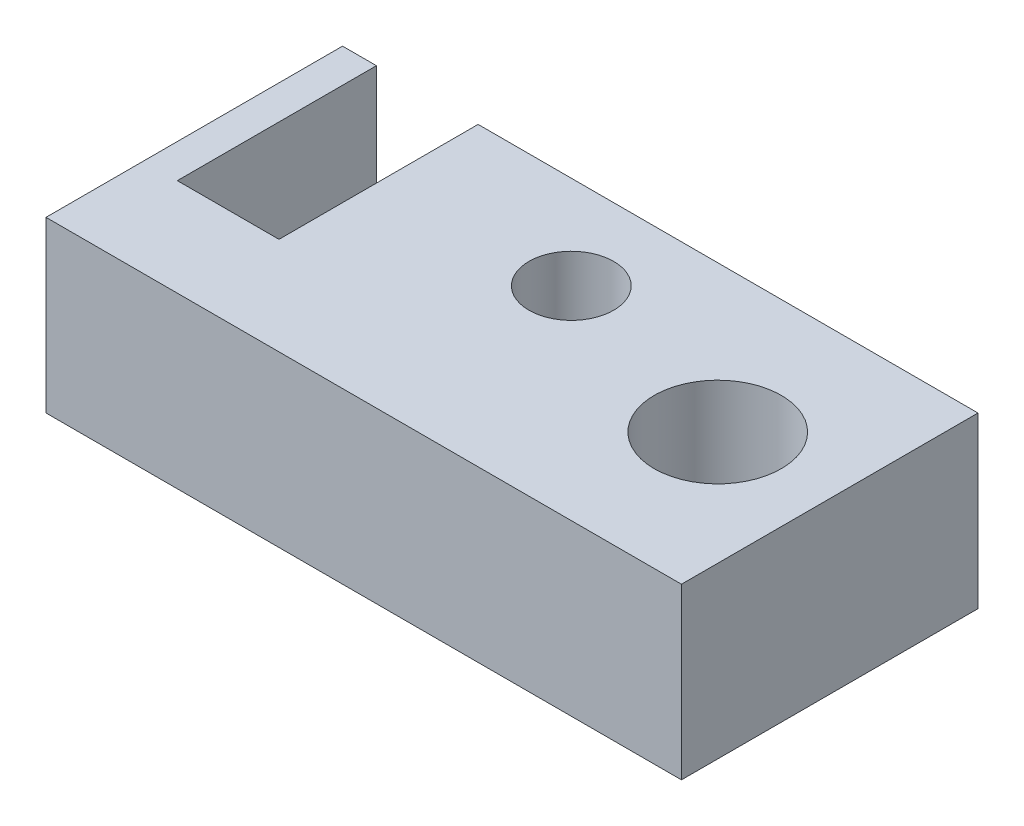
ISO-10303-21;
HEADER;
FILE_DESCRIPTION(('STEP AP214'),'2;1');
FILE_NAME('part.step','',(''),(''),'','','');
FILE_SCHEMA(('AUTOMOTIVE_DESIGN { 1 0 10303 214 1 1 1 1 }'));
ENDSEC;
DATA;
#1=APPLICATION_CONTEXT('core data for automotive mechanical design processes');
#2=APPLICATION_PROTOCOL_DEFINITION('international standard','automotive_design',2000,#1);
#3=PRODUCT_CONTEXT('',#1,'mechanical');
#4=PRODUCT('Part','Part','',(#3));
#5=PRODUCT_RELATED_PRODUCT_CATEGORY('part','',(#4));
#6=PRODUCT_DEFINITION_FORMATION('','',#4);
#7=PRODUCT_DEFINITION_CONTEXT('part definition',#1,'design');
#8=PRODUCT_DEFINITION('design','',#6,#7);
#9=PRODUCT_DEFINITION_SHAPE('','',#8);
#10=(LENGTH_UNIT() NAMED_UNIT(*) SI_UNIT(.MILLI.,.METRE.));
#11=(NAMED_UNIT(*) PLANE_ANGLE_UNIT() SI_UNIT($,.RADIAN.));
#12=(NAMED_UNIT(*) SI_UNIT($,.STERADIAN.) SOLID_ANGLE_UNIT());
#13=UNCERTAINTY_MEASURE_WITH_UNIT(LENGTH_MEASURE(1.E-05),#10,'distance_accuracy_value','');
#14=(GEOMETRIC_REPRESENTATION_CONTEXT(3) GLOBAL_UNCERTAINTY_ASSIGNED_CONTEXT((#13)) GLOBAL_UNIT_ASSIGNED_CONTEXT((#10,
#11,#12)) REPRESENTATION_CONTEXT('',''));
#15=CARTESIAN_POINT('',(0.,0.,0.));
#16=DIRECTION('',(0.,0.,1.));
#17=DIRECTION('',(1.,0.,0.));
#18=AXIS2_PLACEMENT_3D('',#15,#16,#17);
#19=CARTESIAN_POINT('',(0.,20.,0.));
#20=DIRECTION('',(0.,-1.,0.));
#21=DIRECTION('',(0.,0.,-1.));
#22=AXIS2_PLACEMENT_3D('',#19,#20,#21);
#23=PLANE('',#22);
#24=CARTESIAN_POINT('',(0.5,20.,-6.50000000000017));
#25=DIRECTION('',(0.,1.,0.));
#26=DIRECTION('',(0.,0.,1.));
#27=AXIS2_PLACEMENT_3D('',#24,#25,#26);
#28=CIRCLE('',#27,5.);
#29=CARTESIAN_POINT('',(0.5,20.,-1.50000000000017));
#30=VERTEX_POINT('',#29);
#31=EDGE_CURVE('E140',#30,#30,#28,.T.);
#32=ORIENTED_EDGE('',*,*,#31,.F.);
#33=EDGE_LOOP('',(#32));
#34=FACE_BOUND('',#33,.T.);
#35=CARTESIAN_POINT('',(24.0874160820902,20.,-0.196874766099198));
#36=DIRECTION('',(0.,1.,0.));
#37=DIRECTION('',(0.,0.,1.));
#38=AXIS2_PLACEMENT_3D('',#35,#36,#37);
#39=CIRCLE('',#38,7.5);
#40=CARTESIAN_POINT('',(24.0874160820902,20.,7.3031252339008));
#41=VERTEX_POINT('',#40);
#42=EDGE_CURVE('E158',#41,#41,#39,.T.);
#43=ORIENTED_EDGE('',*,*,#42,.F.);
#44=EDGE_LOOP('',(#43));
#45=FACE_BOUND('',#44,.T.);
#46=DIRECTION('',(0.,0.,1.));
#47=VECTOR('',#46,1.);
#48=CARTESIAN_POINT('',(-33.5,20.,-17.5));
#49=LINE('',#48,#47);
#50=CARTESIAN_POINT('',(-33.5,20.,-17.5));
#51=VERTEX_POINT('',#50);
#52=CARTESIAN_POINT('',(-33.5,20.,5.99999999999999));
#53=VERTEX_POINT('',#52);
#54=EDGE_CURVE('E122',#51,#53,#49,.T.);
#55=ORIENTED_EDGE('',*,*,#54,.F.);
#56=DIRECTION('',(-1.,0.,0.));
#57=VECTOR('',#56,1.);
#58=CARTESIAN_POINT('',(-37.5,20.,-17.5));
#59=LINE('',#58,#57);
#60=CARTESIAN_POINT('',(-37.5,20.,-17.5));
#61=VERTEX_POINT('',#60);
#62=EDGE_CURVE('E165',#51,#61,#59,.T.);
#63=ORIENTED_EDGE('',*,*,#62,.T.);
#64=DIRECTION('',(0.,0.,1.));
#65=VECTOR('',#64,1.);
#66=CARTESIAN_POINT('',(-37.5,20.,17.5));
#67=LINE('',#66,#65);
#68=CARTESIAN_POINT('',(-37.5,20.,17.5));
#69=VERTEX_POINT('',#68);
#70=EDGE_CURVE('E168',#61,#69,#67,.T.);
#71=ORIENTED_EDGE('',*,*,#70,.T.);
#72=DIRECTION('',(1.,0.,0.));
#73=VECTOR('',#72,1.);
#74=CARTESIAN_POINT('',(-37.5,20.,17.5));
#75=LINE('',#74,#73);
#76=CARTESIAN_POINT('',(37.5,20.,17.5));
#77=VERTEX_POINT('',#76);
#78=EDGE_CURVE('E64',#69,#77,#75,.T.);
#79=ORIENTED_EDGE('',*,*,#78,.T.);
#80=DIRECTION('',(0.,0.,-1.));
#81=VECTOR('',#80,1.);
#82=CARTESIAN_POINT('',(37.5,20.,17.5));
#83=LINE('',#82,#81);
#84=CARTESIAN_POINT('',(37.5,20.,-17.5));
#85=VERTEX_POINT('',#84);
#86=EDGE_CURVE('E162',#77,#85,#83,.T.);
#87=ORIENTED_EDGE('',*,*,#86,.T.);
#88=CARTESIAN_POINT('',(-21.5,20.,-17.5));
#89=VERTEX_POINT('',#88);
#90=EDGE_CURVE('E93',#85,#89,#59,.T.);
#91=ORIENTED_EDGE('',*,*,#90,.T.);
#92=DIRECTION('',(0.,0.,-1.));
#93=VECTOR('',#92,1.);
#94=CARTESIAN_POINT('',(-21.5,20.,-17.5));
#95=LINE('',#94,#93);
#96=CARTESIAN_POINT('',(-21.5,20.,5.99999999999999));
#97=VERTEX_POINT('',#96);
#98=EDGE_CURVE('E131',#97,#89,#95,.T.);
#99=ORIENTED_EDGE('',*,*,#98,.F.);
#100=DIRECTION('',(1.,0.,0.));
#101=VECTOR('',#100,1.);
#102=CARTESIAN_POINT('',(-33.5,20.,5.99999999999999));
#103=LINE('',#102,#101);
#104=EDGE_CURVE('E138',#53,#97,#103,.T.);
#105=ORIENTED_EDGE('',*,*,#104,.F.);
#106=EDGE_LOOP('',(#55,#63,#71,#79,#87,#91,#99,#105));
#107=FACE_BOUND('',#106,.T.);
#108=ADVANCED_FACE('F36',(#34,#45,#107),#23,.F.);
#109=CARTESIAN_POINT('',(-27.5,20.,-0.196874766099198));
#110=DIRECTION('',(0.,-1.,0.));
#111=DIRECTION('',(0.,0.,-1.));
#112=AXIS2_PLACEMENT_3D('',#109,#110,#111);
#113=CYLINDRICAL_SURFACE('',#112,4.);
#114=CARTESIAN_POINT('',(-27.5,0.,-0.196874766099198));
#115=DIRECTION('',(0.,1.,0.));
#116=DIRECTION('',(0.,0.,1.));
#117=AXIS2_PLACEMENT_3D('',#114,#115,#116);
#118=CIRCLE('',#117,4.);
#119=CARTESIAN_POINT('',(-27.5,0.,3.8031252339008));
#120=VERTEX_POINT('',#119);
#121=EDGE_CURVE('E155',#120,#120,#118,.T.);
#122=ORIENTED_EDGE('',*,*,#121,.F.);
#123=EDGE_LOOP('',(#122));
#124=FACE_BOUND('',#123,.T.);
#125=CARTESIAN_POINT('',(-27.5,5.,-0.196874766099198));
#126=DIRECTION('',(0.,1.,0.));
#127=DIRECTION('',(0.,0.,1.));
#128=AXIS2_PLACEMENT_3D('',#125,#126,#127);
#129=CIRCLE('',#128,4.);
#130=CARTESIAN_POINT('',(-27.5,5.,3.8031252339008));
#131=VERTEX_POINT('',#130);
#132=EDGE_CURVE('E45',#131,#131,#129,.T.);
#133=ORIENTED_EDGE('',*,*,#132,.T.);
#134=EDGE_LOOP('',(#133));
#135=FACE_BOUND('',#134,.T.);
#136=ADVANCED_FACE('F209',(#124,#135),#113,.F.);
#137=CARTESIAN_POINT('',(0.,0.,0.));
#138=DIRECTION('',(0.,-1.,0.));
#139=DIRECTION('',(0.,0.,-1.));
#140=AXIS2_PLACEMENT_3D('',#137,#138,#139);
#141=PLANE('',#140);
#142=CARTESIAN_POINT('',(0.5,0.,-6.50000000000017));
#143=DIRECTION('',(0.,1.,0.));
#144=DIRECTION('',(0.,0.,1.));
#145=AXIS2_PLACEMENT_3D('',#142,#143,#144);
#146=CIRCLE('',#145,5.);
#147=CARTESIAN_POINT('',(0.5,0.,-1.50000000000017));
#148=VERTEX_POINT('',#147);
#149=EDGE_CURVE('E143',#148,#148,#146,.T.);
#150=ORIENTED_EDGE('',*,*,#149,.T.);
#151=EDGE_LOOP('',(#150));
#152=FACE_BOUND('',#151,.T.);
#153=CARTESIAN_POINT('',(24.0874160820902,0.,-0.196874766099198));
#154=DIRECTION('',(0.,1.,0.));
#155=DIRECTION('',(0.,0.,1.));
#156=AXIS2_PLACEMENT_3D('',#153,#154,#155);
#157=CIRCLE('',#156,7.5);
#158=CARTESIAN_POINT('',(24.0874160820902,0.,7.3031252339008));
#159=VERTEX_POINT('',#158);
#160=EDGE_CURVE('E153',#159,#159,#157,.T.);
#161=ORIENTED_EDGE('',*,*,#160,.T.);
#162=EDGE_LOOP('',(#161));
#163=FACE_BOUND('',#162,.T.);
#164=DIRECTION('',(0.,0.,-1.));
#165=VECTOR('',#164,1.);
#166=CARTESIAN_POINT('',(37.5,0.,17.5));
#167=LINE('',#166,#165);
#168=CARTESIAN_POINT('',(37.5,0.,17.5));
#169=VERTEX_POINT('',#168);
#170=CARTESIAN_POINT('',(37.5,0.,-17.5));
#171=VERTEX_POINT('',#170);
#172=EDGE_CURVE('E160',#169,#171,#167,.T.);
#173=ORIENTED_EDGE('',*,*,#172,.F.);
#174=DIRECTION('',(1.,0.,0.));
#175=VECTOR('',#174,1.);
#176=CARTESIAN_POINT('',(-37.5,0.,17.5));
#177=LINE('',#176,#175);
#178=CARTESIAN_POINT('',(-37.5,0.,17.5));
#179=VERTEX_POINT('',#178);
#180=EDGE_CURVE('E81',#179,#169,#177,.T.);
#181=ORIENTED_EDGE('',*,*,#180,.F.);
#182=DIRECTION('',(0.,0.,1.));
#183=VECTOR('',#182,1.);
#184=CARTESIAN_POINT('',(-37.5,0.,17.5));
#185=LINE('',#184,#183);
#186=CARTESIAN_POINT('',(-37.5,0.,-17.5));
#187=VERTEX_POINT('',#186);
#188=EDGE_CURVE('E172',#187,#179,#185,.T.);
#189=ORIENTED_EDGE('',*,*,#188,.F.);
#190=DIRECTION('',(-1.,0.,0.));
#191=VECTOR('',#190,1.);
#192=CARTESIAN_POINT('',(-37.5,0.,-17.5));
#193=LINE('',#192,#191);
#194=EDGE_CURVE('E175',#171,#187,#193,.T.);
#195=ORIENTED_EDGE('',*,*,#194,.F.);
#196=EDGE_LOOP('',(#173,#181,#189,#195));
#197=FACE_BOUND('',#196,.T.);
#198=ORIENTED_EDGE('',*,*,#121,.T.);
#199=EDGE_LOOP('',(#198));
#200=FACE_BOUND('',#199,.T.);
#201=ADVANCED_FACE('F188',(#152,#163,#197,#200),#141,.T.);
#202=CARTESIAN_POINT('',(37.5,20.,17.5));
#203=DIRECTION('',(-1.,0.,0.));
#204=DIRECTION('',(0.,0.,1.));
#205=AXIS2_PLACEMENT_3D('',#202,#203,#204);
#206=PLANE('',#205);
#207=ORIENTED_EDGE('',*,*,#172,.T.);
#208=DIRECTION('',(0.,-1.,0.));
#209=VECTOR('',#208,1.);
#210=CARTESIAN_POINT('',(37.5,20.,-17.5));
#211=LINE('',#210,#209);
#212=EDGE_CURVE('E11',#85,#171,#211,.T.);
#213=ORIENTED_EDGE('',*,*,#212,.F.);
#214=ORIENTED_EDGE('',*,*,#86,.F.);
#215=DIRECTION('',(0.,-1.,0.));
#216=VECTOR('',#215,1.);
#217=CARTESIAN_POINT('',(37.5,20.,17.5));
#218=LINE('',#217,#216);
#219=EDGE_CURVE('E169',#77,#169,#218,.T.);
#220=ORIENTED_EDGE('',*,*,#219,.T.);
#221=EDGE_LOOP('',(#207,#213,#214,#220));
#222=FACE_BOUND('',#221,.T.);
#223=ADVANCED_FACE('F37',(#222),#206,.F.);
#224=CARTESIAN_POINT('',(-37.5,20.,-17.5));
#225=DIRECTION('',(0.,0.,1.));
#226=DIRECTION('',(1.,0.,0.));
#227=AXIS2_PLACEMENT_3D('',#224,#225,#226);
#228=PLANE('',#227);
#229=DIRECTION('',(-1.,0.,0.));
#230=VECTOR('',#229,1.);
#231=CARTESIAN_POINT('',(-33.5,5.,-17.5));
#232=LINE('',#231,#230);
#233=CARTESIAN_POINT('',(-21.5,5.,-17.5));
#234=VERTEX_POINT('',#233);
#235=CARTESIAN_POINT('',(-33.5,5.,-17.5));
#236=VERTEX_POINT('',#235);
#237=EDGE_CURVE('E127',#234,#236,#232,.T.);
#238=ORIENTED_EDGE('',*,*,#237,.F.);
#239=DIRECTION('',(0.,1.,0.));
#240=VECTOR('',#239,1.);
#241=CARTESIAN_POINT('',(-21.5,5.,-17.5));
#242=LINE('',#241,#240);
#243=EDGE_CURVE('E146',#234,#89,#242,.T.);
#244=ORIENTED_EDGE('',*,*,#243,.T.);
#245=ORIENTED_EDGE('',*,*,#90,.F.);
#246=ORIENTED_EDGE('',*,*,#212,.T.);
#247=ORIENTED_EDGE('',*,*,#194,.T.);
#248=DIRECTION('',(0.,-1.,0.));
#249=VECTOR('',#248,1.);
#250=CARTESIAN_POINT('',(-37.5,20.,-17.5));
#251=LINE('',#250,#249);
#252=EDGE_CURVE('E50',#61,#187,#251,.T.);
#253=ORIENTED_EDGE('',*,*,#252,.F.);
#254=ORIENTED_EDGE('',*,*,#62,.F.);
#255=DIRECTION('',(0.,1.,0.));
#256=VECTOR('',#255,1.);
#257=CARTESIAN_POINT('',(-33.5,5.,-17.5));
#258=LINE('',#257,#256);
#259=EDGE_CURVE('E150',#236,#51,#258,.T.);
#260=ORIENTED_EDGE('',*,*,#259,.F.);
#261=EDGE_LOOP('',(#238,#244,#245,#246,#247,#253,#254,#260));
#262=FACE_BOUND('',#261,.T.);
#263=ADVANCED_FACE('F201',(#262),#228,.F.);
#264=CARTESIAN_POINT('',(-37.5,20.,17.5));
#265=DIRECTION('',(1.,0.,0.));
#266=DIRECTION('',(0.,0.,-1.));
#267=AXIS2_PLACEMENT_3D('',#264,#265,#266);
#268=PLANE('',#267);
#269=ORIENTED_EDGE('',*,*,#188,.T.);
#270=DIRECTION('',(0.,-1.,0.));
#271=VECTOR('',#270,1.);
#272=CARTESIAN_POINT('',(-37.5,20.,17.5));
#273=LINE('',#272,#271);
#274=EDGE_CURVE('E178',#69,#179,#273,.T.);
#275=ORIENTED_EDGE('',*,*,#274,.F.);
#276=ORIENTED_EDGE('',*,*,#70,.F.);
#277=ORIENTED_EDGE('',*,*,#252,.T.);
#278=EDGE_LOOP('',(#269,#275,#276,#277));
#279=FACE_BOUND('',#278,.T.);
#280=ADVANCED_FACE('F184',(#279),#268,.F.);
#281=CARTESIAN_POINT('',(-37.5,20.,17.5));
#282=DIRECTION('',(0.,0.,-1.));
#283=DIRECTION('',(-1.,0.,0.));
#284=AXIS2_PLACEMENT_3D('',#281,#282,#283);
#285=PLANE('',#284);
#286=ORIENTED_EDGE('',*,*,#180,.T.);
#287=ORIENTED_EDGE('',*,*,#219,.F.);
#288=ORIENTED_EDGE('',*,*,#78,.F.);
#289=ORIENTED_EDGE('',*,*,#274,.T.);
#290=EDGE_LOOP('',(#286,#287,#288,#289));
#291=FACE_BOUND('',#290,.T.);
#292=ADVANCED_FACE('F193',(#291),#285,.F.);
#293=CARTESIAN_POINT('',(24.0874160820902,20.,-0.196874766099198));
#294=DIRECTION('',(0.,-1.,0.));
#295=DIRECTION('',(0.,0.,-1.));
#296=AXIS2_PLACEMENT_3D('',#293,#294,#295);
#297=CYLINDRICAL_SURFACE('',#296,7.5);
#298=ORIENTED_EDGE('',*,*,#42,.T.);
#299=EDGE_LOOP('',(#298));
#300=FACE_BOUND('',#299,.T.);
#301=ORIENTED_EDGE('',*,*,#160,.F.);
#302=EDGE_LOOP('',(#301));
#303=FACE_BOUND('',#302,.T.);
#304=ADVANCED_FACE('F200',(#300,#303),#297,.F.);
#305=CARTESIAN_POINT('',(-33.5,5.,-17.5));
#306=DIRECTION('',(-1.,0.,0.));
#307=DIRECTION('',(0.,0.,1.));
#308=AXIS2_PLACEMENT_3D('',#305,#306,#307);
#309=PLANE('',#308);
#310=ORIENTED_EDGE('',*,*,#54,.T.);
#311=DIRECTION('',(0.,1.,0.));
#312=VECTOR('',#311,1.);
#313=CARTESIAN_POINT('',(-33.5,5.,5.99999999999999));
#314=LINE('',#313,#312);
#315=CARTESIAN_POINT('',(-33.5,5.,5.99999999999999));
#316=VERTEX_POINT('',#315);
#317=EDGE_CURVE('E114',#316,#53,#314,.T.);
#318=ORIENTED_EDGE('',*,*,#317,.F.);
#319=DIRECTION('',(0.,0.,1.));
#320=VECTOR('',#319,1.);
#321=CARTESIAN_POINT('',(-33.5,5.,-17.5));
#322=LINE('',#321,#320);
#323=EDGE_CURVE('E118',#236,#316,#322,.T.);
#324=ORIENTED_EDGE('',*,*,#323,.F.);
#325=ORIENTED_EDGE('',*,*,#259,.T.);
#326=EDGE_LOOP('',(#310,#318,#324,#325));
#327=FACE_BOUND('',#326,.T.);
#328=ADVANCED_FACE('F120',(#327),#309,.F.);
#329=CARTESIAN_POINT('',(-21.5,5.,-17.5));
#330=DIRECTION('',(1.,0.,0.));
#331=DIRECTION('',(0.,0.,-1.));
#332=AXIS2_PLACEMENT_3D('',#329,#330,#331);
#333=PLANE('',#332);
#334=ORIENTED_EDGE('',*,*,#98,.T.);
#335=ORIENTED_EDGE('',*,*,#243,.F.);
#336=DIRECTION('',(0.,0.,-1.));
#337=VECTOR('',#336,1.);
#338=CARTESIAN_POINT('',(-21.5,5.,-17.5));
#339=LINE('',#338,#337);
#340=CARTESIAN_POINT('',(-21.5,5.,5.99999999999999));
#341=VERTEX_POINT('',#340);
#342=EDGE_CURVE('E53',#341,#234,#339,.T.);
#343=ORIENTED_EDGE('',*,*,#342,.F.);
#344=DIRECTION('',(0.,1.,0.));
#345=VECTOR('',#344,1.);
#346=CARTESIAN_POINT('',(-21.5,5.,5.99999999999999));
#347=LINE('',#346,#345);
#348=EDGE_CURVE('E123',#341,#97,#347,.T.);
#349=ORIENTED_EDGE('',*,*,#348,.T.);
#350=EDGE_LOOP('',(#334,#335,#343,#349));
#351=FACE_BOUND('',#350,.T.);
#352=ADVANCED_FACE('F241',(#351),#333,.F.);
#353=CARTESIAN_POINT('',(-33.5,5.,5.99999999999999));
#354=DIRECTION('',(0.,0.,1.));
#355=DIRECTION('',(1.,0.,0.));
#356=AXIS2_PLACEMENT_3D('',#353,#354,#355);
#357=PLANE('',#356);
#358=ORIENTED_EDGE('',*,*,#104,.T.);
#359=ORIENTED_EDGE('',*,*,#348,.F.);
#360=DIRECTION('',(1.,0.,0.));
#361=VECTOR('',#360,1.);
#362=CARTESIAN_POINT('',(-33.5,5.,5.99999999999999));
#363=LINE('',#362,#361);
#364=EDGE_CURVE('E129',#316,#341,#363,.T.);
#365=ORIENTED_EDGE('',*,*,#364,.F.);
#366=ORIENTED_EDGE('',*,*,#317,.T.);
#367=EDGE_LOOP('',(#358,#359,#365,#366));
#368=FACE_BOUND('',#367,.T.);
#369=ADVANCED_FACE('F126',(#368),#357,.F.);
#370=CARTESIAN_POINT('',(0.,5.,0.));
#371=DIRECTION('',(0.,1.,0.));
#372=DIRECTION('',(0.,0.,1.));
#373=AXIS2_PLACEMENT_3D('',#370,#371,#372);
#374=PLANE('',#373);
#375=ORIENTED_EDGE('',*,*,#132,.F.);
#376=EDGE_LOOP('',(#375));
#377=FACE_BOUND('',#376,.T.);
#378=ORIENTED_EDGE('',*,*,#323,.T.);
#379=ORIENTED_EDGE('',*,*,#364,.T.);
#380=ORIENTED_EDGE('',*,*,#342,.T.);
#381=ORIENTED_EDGE('',*,*,#237,.T.);
#382=EDGE_LOOP('',(#378,#379,#380,#381));
#383=FACE_BOUND('',#382,.T.);
#384=ADVANCED_FACE('F132',(#377,#383),#374,.T.);
#385=CARTESIAN_POINT('',(0.5,0.,-6.50000000000017));
#386=DIRECTION('',(0.,1.,0.));
#387=DIRECTION('',(0.,0.,1.));
#388=AXIS2_PLACEMENT_3D('',#385,#386,#387);
#389=CYLINDRICAL_SURFACE('',#388,5.);
#390=ORIENTED_EDGE('',*,*,#149,.F.);
#391=EDGE_LOOP('',(#390));
#392=FACE_BOUND('',#391,.T.);
#393=ORIENTED_EDGE('',*,*,#31,.T.);
#394=EDGE_LOOP('',(#393));
#395=FACE_BOUND('',#394,.T.);
#396=ADVANCED_FACE('F234',(#392,#395),#389,.F.);
#397=CLOSED_SHELL('',(#108,#136,#201,#223,#263,#280,#292,#304,#328,#352,#369,#384,#396));
#398=MANIFOLD_SOLID_BREP('B2',#397);
#399=ADVANCED_BREP_SHAPE_REPRESENTATION('',(#18,#398),#14);
#400=SHAPE_DEFINITION_REPRESENTATION(#9,#399);
ENDSEC;
END-ISO-10303-21;
